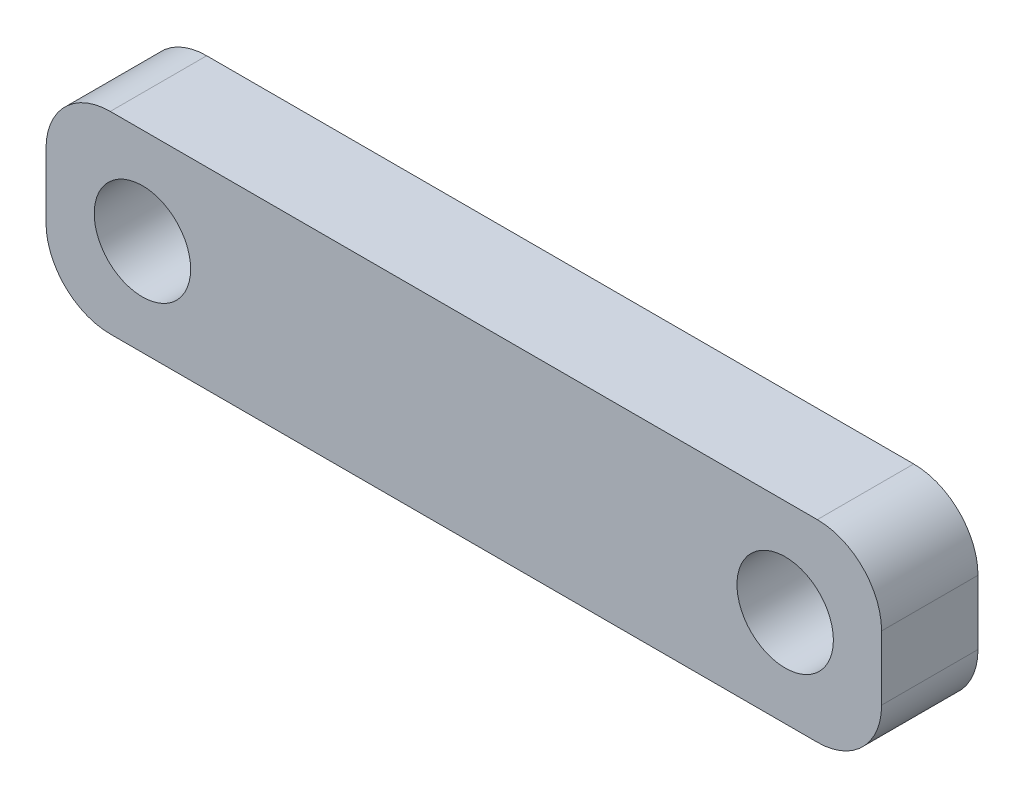
ISO-10303-21;
HEADER;
FILE_DESCRIPTION(('STEP AP214'),'2;1');
FILE_NAME('part.step','',(''),(''),'','','');
FILE_SCHEMA(('AUTOMOTIVE_DESIGN { 1 0 10303 214 1 1 1 1 }'));
ENDSEC;
DATA;
#1=APPLICATION_CONTEXT('core data for automotive mechanical design processes');
#2=APPLICATION_PROTOCOL_DEFINITION('international standard','automotive_design',2000,#1);
#3=PRODUCT_CONTEXT('',#1,'mechanical');
#4=PRODUCT('Part','Part','',(#3));
#5=PRODUCT_RELATED_PRODUCT_CATEGORY('part','',(#4));
#6=PRODUCT_DEFINITION_FORMATION('','',#4);
#7=PRODUCT_DEFINITION_CONTEXT('part definition',#1,'design');
#8=PRODUCT_DEFINITION('design','',#6,#7);
#9=PRODUCT_DEFINITION_SHAPE('','',#8);
#10=(LENGTH_UNIT() NAMED_UNIT(*) SI_UNIT(.MILLI.,.METRE.));
#11=(NAMED_UNIT(*) PLANE_ANGLE_UNIT() SI_UNIT($,.RADIAN.));
#12=(NAMED_UNIT(*) SI_UNIT($,.STERADIAN.) SOLID_ANGLE_UNIT());
#13=UNCERTAINTY_MEASURE_WITH_UNIT(LENGTH_MEASURE(1.E-05),#10,'distance_accuracy_value','');
#14=(GEOMETRIC_REPRESENTATION_CONTEXT(3) GLOBAL_UNCERTAINTY_ASSIGNED_CONTEXT((#13)) GLOBAL_UNIT_ASSIGNED_CONTEXT((#10,
#11,#12)) REPRESENTATION_CONTEXT('',''));
#15=CARTESIAN_POINT('',(0.,0.,0.));
#16=DIRECTION('',(0.,0.,1.));
#17=DIRECTION('',(1.,0.,0.));
#18=AXIS2_PLACEMENT_3D('',#15,#16,#17);
#19=CARTESIAN_POINT('',(0.,0.,3.));
#20=DIRECTION('',(0.,0.,-1.));
#21=DIRECTION('',(-1.,0.,0.));
#22=AXIS2_PLACEMENT_3D('',#19,#20,#21);
#23=PLANE('',#22);
#24=DIRECTION('',(0.,-1.,0.));
#25=VECTOR('',#24,1.);
#26=CARTESIAN_POINT('',(0.,0.,3.));
#27=LINE('',#26,#25);
#28=CARTESIAN_POINT('',(0.,4.,3.));
#29=VERTEX_POINT('',#28);
#30=CARTESIAN_POINT('',(0.,2.,3.));
#31=VERTEX_POINT('',#30);
#32=EDGE_CURVE('E156',#29,#31,#27,.T.);
#33=ORIENTED_EDGE('',*,*,#32,.T.);
#34=CARTESIAN_POINT('',(2.,2.,3.));
#35=DIRECTION('',(0.,0.,-1.));
#36=DIRECTION('',(-1.,0.,0.));
#37=AXIS2_PLACEMENT_3D('',#34,#35,#36);
#38=CIRCLE('',#37,2.);
#39=CARTESIAN_POINT('',(2.,0.,3.));
#40=VERTEX_POINT('',#39);
#41=EDGE_CURVE('E180',#31,#40,#38,.F.);
#42=ORIENTED_EDGE('',*,*,#41,.T.);
#43=DIRECTION('',(1.,0.,0.));
#44=VECTOR('',#43,1.);
#45=CARTESIAN_POINT('',(0.,0.,3.));
#46=LINE('',#45,#44);
#47=CARTESIAN_POINT('',(24.,0.,3.));
#48=VERTEX_POINT('',#47);
#49=EDGE_CURVE('E133',#40,#48,#46,.T.);
#50=ORIENTED_EDGE('',*,*,#49,.T.);
#51=CARTESIAN_POINT('',(24.,2.,3.));
#52=DIRECTION('',(0.,0.,-1.));
#53=DIRECTION('',(-1.,0.,0.));
#54=AXIS2_PLACEMENT_3D('',#51,#52,#53);
#55=CIRCLE('',#54,2.);
#56=CARTESIAN_POINT('',(26.,2.,3.));
#57=VERTEX_POINT('',#56);
#58=EDGE_CURVE('E177',#48,#57,#55,.F.);
#59=ORIENTED_EDGE('',*,*,#58,.T.);
#60=DIRECTION('',(0.,1.,0.));
#61=VECTOR('',#60,1.);
#62=CARTESIAN_POINT('',(26.,0.,3.));
#63=LINE('',#62,#61);
#64=CARTESIAN_POINT('',(26.,4.,3.));
#65=VERTEX_POINT('',#64);
#66=EDGE_CURVE('E192',#57,#65,#63,.T.);
#67=ORIENTED_EDGE('',*,*,#66,.T.);
#68=CARTESIAN_POINT('',(24.,4.,3.));
#69=DIRECTION('',(0.,0.,-1.));
#70=DIRECTION('',(-1.,0.,0.));
#71=AXIS2_PLACEMENT_3D('',#68,#69,#70);
#72=CIRCLE('',#71,2.);
#73=CARTESIAN_POINT('',(24.,6.,3.));
#74=VERTEX_POINT('',#73);
#75=EDGE_CURVE('E67',#65,#74,#72,.F.);
#76=ORIENTED_EDGE('',*,*,#75,.T.);
#77=DIRECTION('',(-1.,0.,0.));
#78=VECTOR('',#77,1.);
#79=CARTESIAN_POINT('',(0.,6.,3.));
#80=LINE('',#79,#78);
#81=CARTESIAN_POINT('',(2.,6.,3.));
#82=VERTEX_POINT('',#81);
#83=EDGE_CURVE('E158',#74,#82,#80,.T.);
#84=ORIENTED_EDGE('',*,*,#83,.T.);
#85=CARTESIAN_POINT('',(2.,4.,3.));
#86=DIRECTION('',(0.,0.,-1.));
#87=DIRECTION('',(-1.,0.,0.));
#88=AXIS2_PLACEMENT_3D('',#85,#86,#87);
#89=CIRCLE('',#88,2.);
#90=EDGE_CURVE('E172',#82,#29,#89,.F.);
#91=ORIENTED_EDGE('',*,*,#90,.T.);
#92=EDGE_LOOP('',(#33,#42,#50,#59,#67,#76,#84,#91));
#93=FACE_BOUND('',#92,.T.);
#94=CARTESIAN_POINT('',(3.,3.,3.));
#95=DIRECTION('',(0.,0.,1.));
#96=DIRECTION('',(1.,0.,0.));
#97=AXIS2_PLACEMENT_3D('',#94,#95,#96);
#98=CIRCLE('',#97,1.5);
#99=CARTESIAN_POINT('',(4.5,3.,3.));
#100=VERTEX_POINT('',#99);
#101=EDGE_CURVE('E150',#100,#100,#98,.T.);
#102=ORIENTED_EDGE('',*,*,#101,.F.);
#103=EDGE_LOOP('',(#102));
#104=FACE_BOUND('',#103,.T.);
#105=CARTESIAN_POINT('',(23.,3.,3.));
#106=DIRECTION('',(0.,0.,1.));
#107=DIRECTION('',(1.,0.,0.));
#108=AXIS2_PLACEMENT_3D('',#105,#106,#107);
#109=CIRCLE('',#108,1.5);
#110=CARTESIAN_POINT('',(24.5,3.,3.));
#111=VERTEX_POINT('',#110);
#112=EDGE_CURVE('E205',#111,#111,#109,.T.);
#113=ORIENTED_EDGE('',*,*,#112,.F.);
#114=EDGE_LOOP('',(#113));
#115=FACE_BOUND('',#114,.T.);
#116=ADVANCED_FACE('F45',(#93,#104,#115),#23,.F.);
#117=CARTESIAN_POINT('',(0.,0.,0.));
#118=DIRECTION('',(0.,0.,-1.));
#119=DIRECTION('',(-1.,0.,0.));
#120=AXIS2_PLACEMENT_3D('',#117,#118,#119);
#121=PLANE('',#120);
#122=CARTESIAN_POINT('',(3.,3.,0.));
#123=DIRECTION('',(0.,0.,1.));
#124=DIRECTION('',(1.,0.,0.));
#125=AXIS2_PLACEMENT_3D('',#122,#123,#124);
#126=CIRCLE('',#125,1.5);
#127=CARTESIAN_POINT('',(4.5,3.,0.));
#128=VERTEX_POINT('',#127);
#129=EDGE_CURVE('E201',#128,#128,#126,.T.);
#130=ORIENTED_EDGE('',*,*,#129,.T.);
#131=EDGE_LOOP('',(#130));
#132=FACE_BOUND('',#131,.T.);
#133=DIRECTION('',(1.,0.,0.));
#134=VECTOR('',#133,1.);
#135=CARTESIAN_POINT('',(0.,0.,0.));
#136=LINE('',#135,#134);
#137=CARTESIAN_POINT('',(2.,0.,0.));
#138=VERTEX_POINT('',#137);
#139=CARTESIAN_POINT('',(24.,0.,0.));
#140=VERTEX_POINT('',#139);
#141=EDGE_CURVE('E130',#138,#140,#136,.T.);
#142=ORIENTED_EDGE('',*,*,#141,.F.);
#143=CARTESIAN_POINT('',(2.,2.,0.));
#144=DIRECTION('',(0.,0.,-1.));
#145=DIRECTION('',(-1.,0.,0.));
#146=AXIS2_PLACEMENT_3D('',#143,#144,#145);
#147=CIRCLE('',#146,2.);
#148=CARTESIAN_POINT('',(0.,2.,0.));
#149=VERTEX_POINT('',#148);
#150=EDGE_CURVE('E112',#138,#149,#147,.T.);
#151=ORIENTED_EDGE('',*,*,#150,.T.);
#152=DIRECTION('',(0.,-1.,0.));
#153=VECTOR('',#152,1.);
#154=CARTESIAN_POINT('',(0.,0.,0.));
#155=LINE('',#154,#153);
#156=CARTESIAN_POINT('',(0.,4.,0.));
#157=VERTEX_POINT('',#156);
#158=EDGE_CURVE('E143',#157,#149,#155,.T.);
#159=ORIENTED_EDGE('',*,*,#158,.F.);
#160=CARTESIAN_POINT('',(2.,4.,0.));
#161=DIRECTION('',(0.,0.,-1.));
#162=DIRECTION('',(-1.,0.,0.));
#163=AXIS2_PLACEMENT_3D('',#160,#161,#162);
#164=CIRCLE('',#163,2.);
#165=CARTESIAN_POINT('',(2.,6.,0.));
#166=VERTEX_POINT('',#165);
#167=EDGE_CURVE('E135',#157,#166,#164,.T.);
#168=ORIENTED_EDGE('',*,*,#167,.T.);
#169=DIRECTION('',(-1.,0.,0.));
#170=VECTOR('',#169,1.);
#171=CARTESIAN_POINT('',(0.,6.,0.));
#172=LINE('',#171,#170);
#173=CARTESIAN_POINT('',(24.,6.,0.));
#174=VERTEX_POINT('',#173);
#175=EDGE_CURVE('E148',#174,#166,#172,.T.);
#176=ORIENTED_EDGE('',*,*,#175,.F.);
#177=CARTESIAN_POINT('',(24.,4.,0.));
#178=DIRECTION('',(0.,0.,-1.));
#179=DIRECTION('',(-1.,0.,0.));
#180=AXIS2_PLACEMENT_3D('',#177,#178,#179);
#181=CIRCLE('',#180,2.);
#182=CARTESIAN_POINT('',(26.,4.,0.));
#183=VERTEX_POINT('',#182);
#184=EDGE_CURVE('E162',#174,#183,#181,.T.);
#185=ORIENTED_EDGE('',*,*,#184,.T.);
#186=DIRECTION('',(0.,1.,0.));
#187=VECTOR('',#186,1.);
#188=CARTESIAN_POINT('',(26.,0.,0.));
#189=LINE('',#188,#187);
#190=CARTESIAN_POINT('',(26.,2.,0.));
#191=VERTEX_POINT('',#190);
#192=EDGE_CURVE('E142',#191,#183,#189,.T.);
#193=ORIENTED_EDGE('',*,*,#192,.F.);
#194=CARTESIAN_POINT('',(24.,2.,0.));
#195=DIRECTION('',(0.,0.,-1.));
#196=DIRECTION('',(-1.,0.,0.));
#197=AXIS2_PLACEMENT_3D('',#194,#195,#196);
#198=CIRCLE('',#197,2.);
#199=EDGE_CURVE('E124',#191,#140,#198,.T.);
#200=ORIENTED_EDGE('',*,*,#199,.T.);
#201=EDGE_LOOP('',(#142,#151,#159,#168,#176,#185,#193,#200));
#202=FACE_BOUND('',#201,.T.);
#203=CARTESIAN_POINT('',(23.,3.,0.));
#204=DIRECTION('',(0.,0.,1.));
#205=DIRECTION('',(1.,0.,0.));
#206=AXIS2_PLACEMENT_3D('',#203,#204,#205);
#207=CIRCLE('',#206,1.5);
#208=CARTESIAN_POINT('',(24.5,3.,0.));
#209=VERTEX_POINT('',#208);
#210=EDGE_CURVE('E209',#209,#209,#207,.T.);
#211=ORIENTED_EDGE('',*,*,#210,.T.);
#212=EDGE_LOOP('',(#211));
#213=FACE_BOUND('',#212,.T.);
#214=ADVANCED_FACE('F138',(#132,#202,#213),#121,.T.);
#215=CARTESIAN_POINT('',(0.,0.,3.));
#216=DIRECTION('',(1.,0.,0.));
#217=DIRECTION('',(0.,0.,-1.));
#218=AXIS2_PLACEMENT_3D('',#215,#216,#217);
#219=PLANE('',#218);
#220=ORIENTED_EDGE('',*,*,#158,.T.);
#221=DIRECTION('',(0.,0.,-1.));
#222=VECTOR('',#221,1.);
#223=CARTESIAN_POINT('',(0.,2.,3.));
#224=LINE('',#223,#222);
#225=EDGE_CURVE('E117',#149,#31,#224,.F.);
#226=ORIENTED_EDGE('',*,*,#225,.T.);
#227=ORIENTED_EDGE('',*,*,#32,.F.);
#228=DIRECTION('',(0.,0.,-1.));
#229=VECTOR('',#228,1.);
#230=CARTESIAN_POINT('',(0.,4.,3.));
#231=LINE('',#230,#229);
#232=EDGE_CURVE('E123',#29,#157,#231,.T.);
#233=ORIENTED_EDGE('',*,*,#232,.T.);
#234=EDGE_LOOP('',(#220,#226,#227,#233));
#235=FACE_BOUND('',#234,.T.);
#236=ADVANCED_FACE('F226',(#235),#219,.F.);
#237=CARTESIAN_POINT('',(0.,0.,3.));
#238=DIRECTION('',(0.,1.,0.));
#239=DIRECTION('',(0.,0.,1.));
#240=AXIS2_PLACEMENT_3D('',#237,#238,#239);
#241=PLANE('',#240);
#242=ORIENTED_EDGE('',*,*,#49,.F.);
#243=DIRECTION('',(0.,0.,-1.));
#244=VECTOR('',#243,1.);
#245=CARTESIAN_POINT('',(2.,0.,3.));
#246=LINE('',#245,#244);
#247=EDGE_CURVE('E116',#40,#138,#246,.T.);
#248=ORIENTED_EDGE('',*,*,#247,.T.);
#249=ORIENTED_EDGE('',*,*,#141,.T.);
#250=DIRECTION('',(0.,0.,-1.));
#251=VECTOR('',#250,1.);
#252=CARTESIAN_POINT('',(24.,0.,3.));
#253=LINE('',#252,#251);
#254=EDGE_CURVE('E136',#140,#48,#253,.F.);
#255=ORIENTED_EDGE('',*,*,#254,.T.);
#256=EDGE_LOOP('',(#242,#248,#249,#255));
#257=FACE_BOUND('',#256,.T.);
#258=ADVANCED_FACE('F129',(#257),#241,.F.);
#259=CARTESIAN_POINT('',(26.,0.,3.));
#260=DIRECTION('',(-1.,0.,0.));
#261=DIRECTION('',(0.,-1.,0.));
#262=AXIS2_PLACEMENT_3D('',#259,#260,#261);
#263=PLANE('',#262);
#264=ORIENTED_EDGE('',*,*,#66,.F.);
#265=DIRECTION('',(0.,0.,-1.));
#266=VECTOR('',#265,1.);
#267=CARTESIAN_POINT('',(26.,2.,3.));
#268=LINE('',#267,#266);
#269=EDGE_CURVE('E186',#57,#191,#268,.T.);
#270=ORIENTED_EDGE('',*,*,#269,.T.);
#271=ORIENTED_EDGE('',*,*,#192,.T.);
#272=DIRECTION('',(0.,0.,-1.));
#273=VECTOR('',#272,1.);
#274=CARTESIAN_POINT('',(26.,4.,3.));
#275=LINE('',#274,#273);
#276=EDGE_CURVE('E183',#183,#65,#275,.F.);
#277=ORIENTED_EDGE('',*,*,#276,.T.);
#278=EDGE_LOOP('',(#264,#270,#271,#277));
#279=FACE_BOUND('',#278,.T.);
#280=ADVANCED_FACE('F237',(#279),#263,.F.);
#281=CARTESIAN_POINT('',(0.,6.,3.));
#282=DIRECTION('',(0.,-1.,0.));
#283=DIRECTION('',(0.,0.,-1.));
#284=AXIS2_PLACEMENT_3D('',#281,#282,#283);
#285=PLANE('',#284);
#286=ORIENTED_EDGE('',*,*,#83,.F.);
#287=DIRECTION('',(0.,0.,-1.));
#288=VECTOR('',#287,1.);
#289=CARTESIAN_POINT('',(24.,6.,3.));
#290=LINE('',#289,#288);
#291=EDGE_CURVE('E11',#74,#174,#290,.T.);
#292=ORIENTED_EDGE('',*,*,#291,.T.);
#293=ORIENTED_EDGE('',*,*,#175,.T.);
#294=DIRECTION('',(0.,0.,-1.));
#295=VECTOR('',#294,1.);
#296=CARTESIAN_POINT('',(2.,6.,3.));
#297=LINE('',#296,#295);
#298=EDGE_CURVE('E54',#166,#82,#297,.F.);
#299=ORIENTED_EDGE('',*,*,#298,.T.);
#300=EDGE_LOOP('',(#286,#292,#293,#299));
#301=FACE_BOUND('',#300,.T.);
#302=ADVANCED_FACE('F234',(#301),#285,.F.);
#303=CARTESIAN_POINT('',(3.,3.,3.));
#304=DIRECTION('',(0.,0.,-1.));
#305=DIRECTION('',(-1.,0.,0.));
#306=AXIS2_PLACEMENT_3D('',#303,#304,#305);
#307=CYLINDRICAL_SURFACE('',#306,1.5);
#308=ORIENTED_EDGE('',*,*,#101,.T.);
#309=EDGE_LOOP('',(#308));
#310=FACE_BOUND('',#309,.T.);
#311=ORIENTED_EDGE('',*,*,#129,.F.);
#312=EDGE_LOOP('',(#311));
#313=FACE_BOUND('',#312,.T.);
#314=ADVANCED_FACE('F231',(#310,#313),#307,.F.);
#315=CARTESIAN_POINT('',(23.,3.,3.));
#316=DIRECTION('',(0.,0.,-1.));
#317=DIRECTION('',(-1.,0.,0.));
#318=AXIS2_PLACEMENT_3D('',#315,#316,#317);
#319=CYLINDRICAL_SURFACE('',#318,1.5);
#320=ORIENTED_EDGE('',*,*,#112,.T.);
#321=EDGE_LOOP('',(#320));
#322=FACE_BOUND('',#321,.T.);
#323=ORIENTED_EDGE('',*,*,#210,.F.);
#324=EDGE_LOOP('',(#323));
#325=FACE_BOUND('',#324,.T.);
#326=ADVANCED_FACE('F217',(#322,#325),#319,.F.);
#327=CARTESIAN_POINT('',(2.,2.,3.));
#328=DIRECTION('',(0.,0.,-1.));
#329=DIRECTION('',(-1.,0.,0.));
#330=AXIS2_PLACEMENT_3D('',#327,#328,#329);
#331=CYLINDRICAL_SURFACE('',#330,2.);
#332=ORIENTED_EDGE('',*,*,#41,.F.);
#333=ORIENTED_EDGE('',*,*,#225,.F.);
#334=ORIENTED_EDGE('',*,*,#150,.F.);
#335=ORIENTED_EDGE('',*,*,#247,.F.);
#336=EDGE_LOOP('',(#332,#333,#334,#335));
#337=FACE_BOUND('',#336,.T.);
#338=ADVANCED_FACE('F115',(#337),#331,.T.);
#339=CARTESIAN_POINT('',(24.,2.,3.));
#340=DIRECTION('',(0.,0.,-1.));
#341=DIRECTION('',(-1.,0.,0.));
#342=AXIS2_PLACEMENT_3D('',#339,#340,#341);
#343=CYLINDRICAL_SURFACE('',#342,2.);
#344=ORIENTED_EDGE('',*,*,#58,.F.);
#345=ORIENTED_EDGE('',*,*,#254,.F.);
#346=ORIENTED_EDGE('',*,*,#199,.F.);
#347=ORIENTED_EDGE('',*,*,#269,.F.);
#348=EDGE_LOOP('',(#344,#345,#346,#347));
#349=FACE_BOUND('',#348,.T.);
#350=ADVANCED_FACE('F248',(#349),#343,.T.);
#351=CARTESIAN_POINT('',(24.,4.,3.));
#352=DIRECTION('',(0.,0.,-1.));
#353=DIRECTION('',(-1.,0.,0.));
#354=AXIS2_PLACEMENT_3D('',#351,#352,#353);
#355=CYLINDRICAL_SURFACE('',#354,2.);
#356=ORIENTED_EDGE('',*,*,#75,.F.);
#357=ORIENTED_EDGE('',*,*,#276,.F.);
#358=ORIENTED_EDGE('',*,*,#184,.F.);
#359=ORIENTED_EDGE('',*,*,#291,.F.);
#360=EDGE_LOOP('',(#356,#357,#358,#359));
#361=FACE_BOUND('',#360,.T.);
#362=ADVANCED_FACE('F250',(#361),#355,.T.);
#363=CARTESIAN_POINT('',(2.,4.,3.));
#364=DIRECTION('',(0.,0.,-1.));
#365=DIRECTION('',(-1.,0.,0.));
#366=AXIS2_PLACEMENT_3D('',#363,#364,#365);
#367=CYLINDRICAL_SURFACE('',#366,2.);
#368=ORIENTED_EDGE('',*,*,#90,.F.);
#369=ORIENTED_EDGE('',*,*,#298,.F.);
#370=ORIENTED_EDGE('',*,*,#167,.F.);
#371=ORIENTED_EDGE('',*,*,#232,.F.);
#372=EDGE_LOOP('',(#368,#369,#370,#371));
#373=FACE_BOUND('',#372,.T.);
#374=ADVANCED_FACE('F47',(#373),#367,.T.);
#375=CLOSED_SHELL('',(#116,#214,#236,#258,#280,#302,#314,#326,#338,#350,#362,#374));
#376=MANIFOLD_SOLID_BREP('B2',#375);
#377=ADVANCED_BREP_SHAPE_REPRESENTATION('',(#18,#376),#14);
#378=SHAPE_DEFINITION_REPRESENTATION(#9,#377);
ENDSEC;
END-ISO-10303-21;
